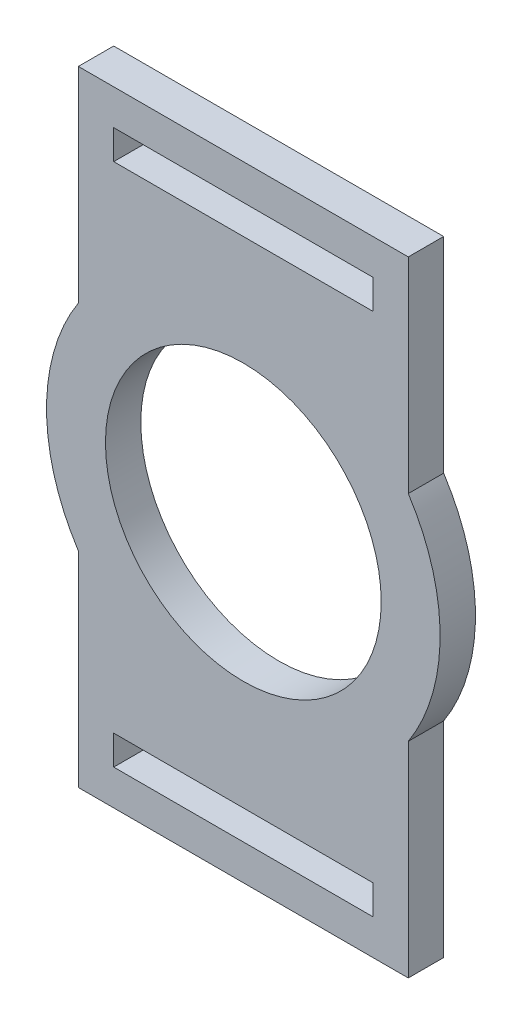
ISO-10303-21;
HEADER;
FILE_DESCRIPTION(('STEP AP214'),'2;1');
FILE_NAME('part.step','',(''),(''),'','','');
FILE_SCHEMA(('AUTOMOTIVE_DESIGN { 1 0 10303 214 1 1 1 1 }'));
ENDSEC;
DATA;
#1=APPLICATION_CONTEXT('core data for automotive mechanical design processes');
#2=APPLICATION_PROTOCOL_DEFINITION('international standard','automotive_design',2000,#1);
#3=PRODUCT_CONTEXT('',#1,'mechanical');
#4=PRODUCT('Part','Part','',(#3));
#5=PRODUCT_RELATED_PRODUCT_CATEGORY('part','',(#4));
#6=PRODUCT_DEFINITION_FORMATION('','',#4);
#7=PRODUCT_DEFINITION_CONTEXT('part definition',#1,'design');
#8=PRODUCT_DEFINITION('design','',#6,#7);
#9=PRODUCT_DEFINITION_SHAPE('','',#8);
#10=(LENGTH_UNIT() NAMED_UNIT(*) SI_UNIT(.MILLI.,.METRE.));
#11=(NAMED_UNIT(*) PLANE_ANGLE_UNIT() SI_UNIT($,.RADIAN.));
#12=(NAMED_UNIT(*) SI_UNIT($,.STERADIAN.) SOLID_ANGLE_UNIT());
#13=UNCERTAINTY_MEASURE_WITH_UNIT(LENGTH_MEASURE(1.E-05),#10,'distance_accuracy_value','');
#14=(GEOMETRIC_REPRESENTATION_CONTEXT(3) GLOBAL_UNCERTAINTY_ASSIGNED_CONTEXT((#13)) GLOBAL_UNIT_ASSIGNED_CONTEXT((#10,
#11,#12)) REPRESENTATION_CONTEXT('',''));
#15=CARTESIAN_POINT('',(0.,0.,0.));
#16=DIRECTION('',(0.,0.,1.));
#17=DIRECTION('',(1.,0.,0.));
#18=AXIS2_PLACEMENT_3D('',#15,#16,#17);
#19=CARTESIAN_POINT('',(0.,0.,3.));
#20=DIRECTION('',(0.,0.,-1.));
#21=DIRECTION('',(-1.,0.,0.));
#22=AXIS2_PLACEMENT_3D('',#19,#20,#21);
#23=PLANE('',#22);
#24=DIRECTION('',(0.,-1.,0.));
#25=VECTOR('',#24,1.);
#26=CARTESIAN_POINT('',(-11.,21.,3.));
#27=LINE('',#26,#25);
#28=CARTESIAN_POINT('',(-11.,23.5,3.));
#29=VERTEX_POINT('',#28);
#30=CARTESIAN_POINT('',(-11.,21.,3.));
#31=VERTEX_POINT('',#30);
#32=EDGE_CURVE('E185',#29,#31,#27,.T.);
#33=ORIENTED_EDGE('',*,*,#32,.F.);
#34=DIRECTION('',(-1.,0.,0.));
#35=VECTOR('',#34,1.);
#36=CARTESIAN_POINT('',(-11.,23.5,3.));
#37=LINE('',#36,#35);
#38=CARTESIAN_POINT('',(11.,23.5,3.));
#39=VERTEX_POINT('',#38);
#40=EDGE_CURVE('E193',#39,#29,#37,.T.);
#41=ORIENTED_EDGE('',*,*,#40,.F.);
#42=DIRECTION('',(0.,1.,0.));
#43=VECTOR('',#42,1.);
#44=CARTESIAN_POINT('',(11.,21.,3.));
#45=LINE('',#44,#43);
#46=CARTESIAN_POINT('',(11.,21.,3.));
#47=VERTEX_POINT('',#46);
#48=EDGE_CURVE('E190',#47,#39,#45,.T.);
#49=ORIENTED_EDGE('',*,*,#48,.F.);
#50=DIRECTION('',(1.,0.,0.));
#51=VECTOR('',#50,1.);
#52=CARTESIAN_POINT('',(11.,21.,3.));
#53=LINE('',#52,#51);
#54=EDGE_CURVE('E187',#31,#47,#53,.T.);
#55=ORIENTED_EDGE('',*,*,#54,.F.);
#56=EDGE_LOOP('',(#33,#41,#49,#55));
#57=FACE_BOUND('',#56,.T.);
#58=CARTESIAN_POINT('',(0.,0.,3.));
#59=DIRECTION('',(0.,0.,1.));
#60=DIRECTION('',(-1.,0.,0.));
#61=AXIS2_PLACEMENT_3D('',#58,#59,#60);
#62=CIRCLE('',#61,16.7);
#63=CARTESIAN_POINT('',(-14.,9.10439454329611,3.));
#64=VERTEX_POINT('',#63);
#65=CARTESIAN_POINT('',(-14.,-9.10439454329611,3.));
#66=VERTEX_POINT('',#65);
#67=EDGE_CURVE('E222',#64,#66,#62,.T.);
#68=ORIENTED_EDGE('',*,*,#67,.T.);
#69=DIRECTION('',(0.,-1.,0.));
#70=VECTOR('',#69,1.);
#71=CARTESIAN_POINT('',(-14.,-9.10439454329611,3.));
#72=LINE('',#71,#70);
#73=CARTESIAN_POINT('',(-14.,-26.5,3.));
#74=VERTEX_POINT('',#73);
#75=EDGE_CURVE('E225',#66,#74,#72,.T.);
#76=ORIENTED_EDGE('',*,*,#75,.T.);
#77=DIRECTION('',(1.,0.,0.));
#78=VECTOR('',#77,1.);
#79=CARTESIAN_POINT('',(-14.,-26.5,3.));
#80=LINE('',#79,#78);
#81=CARTESIAN_POINT('',(14.,-26.5,3.));
#82=VERTEX_POINT('',#81);
#83=EDGE_CURVE('E228',#74,#82,#80,.T.);
#84=ORIENTED_EDGE('',*,*,#83,.T.);
#85=DIRECTION('',(0.,1.,0.));
#86=VECTOR('',#85,1.);
#87=CARTESIAN_POINT('',(14.,-9.10439454329611,3.));
#88=LINE('',#87,#86);
#89=CARTESIAN_POINT('',(14.,-9.10439454329611,3.));
#90=VERTEX_POINT('',#89);
#91=EDGE_CURVE('E230',#82,#90,#88,.T.);
#92=ORIENTED_EDGE('',*,*,#91,.T.);
#93=CARTESIAN_POINT('',(-2.18575157973078E-13,0.,3.));
#94=DIRECTION('',(0.,0.,1.));
#95=DIRECTION('',(-1.,0.,0.));
#96=AXIS2_PLACEMENT_3D('',#93,#94,#95);
#97=CIRCLE('',#96,16.7000000000002);
#98=CARTESIAN_POINT('',(14.,9.10439454329611,3.));
#99=VERTEX_POINT('',#98);
#100=EDGE_CURVE('E232',#90,#99,#97,.T.);
#101=ORIENTED_EDGE('',*,*,#100,.T.);
#102=DIRECTION('',(0.,1.,0.));
#103=VECTOR('',#102,1.);
#104=CARTESIAN_POINT('',(14.,9.10439454329611,3.));
#105=LINE('',#104,#103);
#106=CARTESIAN_POINT('',(14.,26.5,3.));
#107=VERTEX_POINT('',#106);
#108=EDGE_CURVE('E234',#99,#107,#105,.T.);
#109=ORIENTED_EDGE('',*,*,#108,.T.);
#110=DIRECTION('',(-1.,0.,0.));
#111=VECTOR('',#110,1.);
#112=CARTESIAN_POINT('',(-14.,26.5,3.));
#113=LINE('',#112,#111);
#114=CARTESIAN_POINT('',(-14.,26.5,3.));
#115=VERTEX_POINT('',#114);
#116=EDGE_CURVE('E236',#107,#115,#113,.T.);
#117=ORIENTED_EDGE('',*,*,#116,.T.);
#118=DIRECTION('',(0.,-1.,0.));
#119=VECTOR('',#118,1.);
#120=CARTESIAN_POINT('',(-14.,9.10439454329611,3.));
#121=LINE('',#120,#119);
#122=EDGE_CURVE('E238',#115,#64,#121,.T.);
#123=ORIENTED_EDGE('',*,*,#122,.T.);
#124=EDGE_LOOP('',(#68,#76,#84,#92,#101,#109,#117,#123));
#125=FACE_BOUND('',#124,.T.);
#126=CARTESIAN_POINT('',(0.,0.,3.));
#127=DIRECTION('',(0.,0.,1.));
#128=DIRECTION('',(1.,0.,0.));
#129=AXIS2_PLACEMENT_3D('',#126,#127,#128);
#130=CIRCLE('',#129,11.7);
#131=CARTESIAN_POINT('',(11.7,0.,3.));
#132=VERTEX_POINT('',#131);
#133=EDGE_CURVE('E216',#132,#132,#130,.T.);
#134=ORIENTED_EDGE('',*,*,#133,.F.);
#135=EDGE_LOOP('',(#134));
#136=FACE_BOUND('',#135,.T.);
#137=DIRECTION('',(-1.,0.,0.));
#138=VECTOR('',#137,1.);
#139=CARTESIAN_POINT('',(11.,-21.,3.));
#140=LINE('',#139,#138);
#141=CARTESIAN_POINT('',(11.,-21.,3.));
#142=VERTEX_POINT('',#141);
#143=CARTESIAN_POINT('',(-11.,-21.,3.));
#144=VERTEX_POINT('',#143);
#145=EDGE_CURVE('E149',#142,#144,#140,.T.);
#146=ORIENTED_EDGE('',*,*,#145,.F.);
#147=DIRECTION('',(0.,1.,0.));
#148=VECTOR('',#147,1.);
#149=CARTESIAN_POINT('',(11.,-21.,3.));
#150=LINE('',#149,#148);
#151=CARTESIAN_POINT('',(11.,-23.5,3.));
#152=VERTEX_POINT('',#151);
#153=EDGE_CURVE('E171',#152,#142,#150,.T.);
#154=ORIENTED_EDGE('',*,*,#153,.F.);
#155=DIRECTION('',(1.,0.,0.));
#156=VECTOR('',#155,1.);
#157=CARTESIAN_POINT('',(-11.,-23.5,3.));
#158=LINE('',#157,#156);
#159=CARTESIAN_POINT('',(-11.,-23.5,3.));
#160=VERTEX_POINT('',#159);
#161=EDGE_CURVE('E169',#160,#152,#158,.T.);
#162=ORIENTED_EDGE('',*,*,#161,.F.);
#163=DIRECTION('',(0.,-1.,0.));
#164=VECTOR('',#163,1.);
#165=CARTESIAN_POINT('',(-11.,-21.,3.));
#166=LINE('',#165,#164);
#167=EDGE_CURVE('E157',#144,#160,#166,.T.);
#168=ORIENTED_EDGE('',*,*,#167,.F.);
#169=EDGE_LOOP('',(#146,#154,#162,#168));
#170=FACE_BOUND('',#169,.T.);
#171=ADVANCED_FACE('F36',(#57,#125,#136,#170),#23,.F.);
#172=CARTESIAN_POINT('',(0.,0.,0.));
#173=DIRECTION('',(0.,0.,-1.));
#174=DIRECTION('',(-1.,0.,0.));
#175=AXIS2_PLACEMENT_3D('',#172,#173,#174);
#176=PLANE('',#175);
#177=CARTESIAN_POINT('',(0.,0.,0.));
#178=DIRECTION('',(0.,0.,1.));
#179=DIRECTION('',(-1.,0.,0.));
#180=AXIS2_PLACEMENT_3D('',#177,#178,#179);
#181=CIRCLE('',#180,16.7);
#182=CARTESIAN_POINT('',(-14.,9.10439454329611,0.));
#183=VERTEX_POINT('',#182);
#184=CARTESIAN_POINT('',(-14.,-9.10439454329611,0.));
#185=VERTEX_POINT('',#184);
#186=EDGE_CURVE('E219',#183,#185,#181,.T.);
#187=ORIENTED_EDGE('',*,*,#186,.F.);
#188=DIRECTION('',(0.,-1.,0.));
#189=VECTOR('',#188,1.);
#190=CARTESIAN_POINT('',(-14.,9.10439454329611,0.));
#191=LINE('',#190,#189);
#192=CARTESIAN_POINT('',(-14.,26.5,0.));
#193=VERTEX_POINT('',#192);
#194=EDGE_CURVE('E226',#193,#183,#191,.T.);
#195=ORIENTED_EDGE('',*,*,#194,.F.);
#196=DIRECTION('',(-1.,0.,0.));
#197=VECTOR('',#196,1.);
#198=CARTESIAN_POINT('',(-14.,26.5,0.));
#199=LINE('',#198,#197);
#200=CARTESIAN_POINT('',(14.,26.5,0.));
#201=VERTEX_POINT('',#200);
#202=EDGE_CURVE('E253',#201,#193,#199,.T.);
#203=ORIENTED_EDGE('',*,*,#202,.F.);
#204=DIRECTION('',(0.,1.,0.));
#205=VECTOR('',#204,1.);
#206=CARTESIAN_POINT('',(14.,9.10439454329611,0.));
#207=LINE('',#206,#205);
#208=CARTESIAN_POINT('',(14.,9.10439454329611,0.));
#209=VERTEX_POINT('',#208);
#210=EDGE_CURVE('E251',#209,#201,#207,.T.);
#211=ORIENTED_EDGE('',*,*,#210,.F.);
#212=CARTESIAN_POINT('',(-2.18575157973078E-13,0.,0.));
#213=DIRECTION('',(0.,0.,1.));
#214=DIRECTION('',(-1.,0.,0.));
#215=AXIS2_PLACEMENT_3D('',#212,#213,#214);
#216=CIRCLE('',#215,16.7000000000002);
#217=CARTESIAN_POINT('',(14.,-9.10439454329611,0.));
#218=VERTEX_POINT('',#217);
#219=EDGE_CURVE('E249',#218,#209,#216,.T.);
#220=ORIENTED_EDGE('',*,*,#219,.F.);
#221=DIRECTION('',(0.,1.,0.));
#222=VECTOR('',#221,1.);
#223=CARTESIAN_POINT('',(14.,-9.10439454329611,0.));
#224=LINE('',#223,#222);
#225=CARTESIAN_POINT('',(14.,-26.5,0.));
#226=VERTEX_POINT('',#225);
#227=EDGE_CURVE('E247',#226,#218,#224,.T.);
#228=ORIENTED_EDGE('',*,*,#227,.F.);
#229=DIRECTION('',(1.,0.,0.));
#230=VECTOR('',#229,1.);
#231=CARTESIAN_POINT('',(-14.,-26.5,0.));
#232=LINE('',#231,#230);
#233=CARTESIAN_POINT('',(-14.,-26.5,0.));
#234=VERTEX_POINT('',#233);
#235=EDGE_CURVE('E245',#234,#226,#232,.T.);
#236=ORIENTED_EDGE('',*,*,#235,.F.);
#237=DIRECTION('',(0.,-1.,0.));
#238=VECTOR('',#237,1.);
#239=CARTESIAN_POINT('',(-14.,-9.10439454329611,0.));
#240=LINE('',#239,#238);
#241=EDGE_CURVE('E243',#185,#234,#240,.T.);
#242=ORIENTED_EDGE('',*,*,#241,.F.);
#243=EDGE_LOOP('',(#187,#195,#203,#211,#220,#228,#236,#242));
#244=FACE_BOUND('',#243,.T.);
#245=CARTESIAN_POINT('',(0.,0.,0.));
#246=DIRECTION('',(0.,0.,1.));
#247=DIRECTION('',(1.,0.,0.));
#248=AXIS2_PLACEMENT_3D('',#245,#246,#247);
#249=CIRCLE('',#248,11.7);
#250=CARTESIAN_POINT('',(11.7,0.,0.));
#251=VERTEX_POINT('',#250);
#252=EDGE_CURVE('E215',#251,#251,#249,.T.);
#253=ORIENTED_EDGE('',*,*,#252,.T.);
#254=EDGE_LOOP('',(#253));
#255=FACE_BOUND('',#254,.T.);
#256=DIRECTION('',(-1.,0.,0.));
#257=VECTOR('',#256,1.);
#258=CARTESIAN_POINT('',(-11.,23.5,0.));
#259=LINE('',#258,#257);
#260=CARTESIAN_POINT('',(11.,23.5,0.));
#261=VERTEX_POINT('',#260);
#262=CARTESIAN_POINT('',(-11.,23.5,0.));
#263=VERTEX_POINT('',#262);
#264=EDGE_CURVE('E188',#261,#263,#259,.T.);
#265=ORIENTED_EDGE('',*,*,#264,.T.);
#266=DIRECTION('',(0.,-1.,0.));
#267=VECTOR('',#266,1.);
#268=CARTESIAN_POINT('',(-11.,21.,0.));
#269=LINE('',#268,#267);
#270=CARTESIAN_POINT('',(-11.,21.,0.));
#271=VERTEX_POINT('',#270);
#272=EDGE_CURVE('E165',#263,#271,#269,.T.);
#273=ORIENTED_EDGE('',*,*,#272,.T.);
#274=DIRECTION('',(1.,0.,0.));
#275=VECTOR('',#274,1.);
#276=CARTESIAN_POINT('',(11.,21.,0.));
#277=LINE('',#276,#275);
#278=CARTESIAN_POINT('',(11.,21.,0.));
#279=VERTEX_POINT('',#278);
#280=EDGE_CURVE('E198',#271,#279,#277,.T.);
#281=ORIENTED_EDGE('',*,*,#280,.T.);
#282=DIRECTION('',(0.,1.,0.));
#283=VECTOR('',#282,1.);
#284=CARTESIAN_POINT('',(11.,21.,0.));
#285=LINE('',#284,#283);
#286=EDGE_CURVE('E201',#279,#261,#285,.T.);
#287=ORIENTED_EDGE('',*,*,#286,.T.);
#288=EDGE_LOOP('',(#265,#273,#281,#287));
#289=FACE_BOUND('',#288,.T.);
#290=DIRECTION('',(0.,1.,0.));
#291=VECTOR('',#290,1.);
#292=CARTESIAN_POINT('',(11.,-21.,0.));
#293=LINE('',#292,#291);
#294=CARTESIAN_POINT('',(11.,-23.5,0.));
#295=VERTEX_POINT('',#294);
#296=CARTESIAN_POINT('',(11.,-21.,0.));
#297=VERTEX_POINT('',#296);
#298=EDGE_CURVE('E158',#295,#297,#293,.T.);
#299=ORIENTED_EDGE('',*,*,#298,.T.);
#300=DIRECTION('',(-1.,0.,0.));
#301=VECTOR('',#300,1.);
#302=CARTESIAN_POINT('',(11.,-21.,0.));
#303=LINE('',#302,#301);
#304=CARTESIAN_POINT('',(-11.,-21.,0.));
#305=VERTEX_POINT('',#304);
#306=EDGE_CURVE('E59',#297,#305,#303,.T.);
#307=ORIENTED_EDGE('',*,*,#306,.T.);
#308=DIRECTION('',(0.,-1.,0.));
#309=VECTOR('',#308,1.);
#310=CARTESIAN_POINT('',(-11.,-21.,0.));
#311=LINE('',#310,#309);
#312=CARTESIAN_POINT('',(-11.,-23.5,0.));
#313=VERTEX_POINT('',#312);
#314=EDGE_CURVE('E164',#305,#313,#311,.T.);
#315=ORIENTED_EDGE('',*,*,#314,.T.);
#316=DIRECTION('',(1.,0.,0.));
#317=VECTOR('',#316,1.);
#318=CARTESIAN_POINT('',(-11.,-23.5,0.));
#319=LINE('',#318,#317);
#320=EDGE_CURVE('E177',#313,#295,#319,.T.);
#321=ORIENTED_EDGE('',*,*,#320,.T.);
#322=EDGE_LOOP('',(#299,#307,#315,#321));
#323=FACE_BOUND('',#322,.T.);
#324=ADVANCED_FACE('F283',(#244,#255,#289,#323),#176,.T.);
#325=CARTESIAN_POINT('',(0.,0.,3.));
#326=DIRECTION('',(0.,0.,-1.));
#327=DIRECTION('',(-1.,0.,0.));
#328=AXIS2_PLACEMENT_3D('',#325,#326,#327);
#329=CYLINDRICAL_SURFACE('',#328,16.7);
#330=ORIENTED_EDGE('',*,*,#186,.T.);
#331=DIRECTION('',(0.,0.,-1.));
#332=VECTOR('',#331,1.);
#333=CARTESIAN_POINT('',(-14.,-9.10439454329611,3.));
#334=LINE('',#333,#332);
#335=EDGE_CURVE('E11',#66,#185,#334,.T.);
#336=ORIENTED_EDGE('',*,*,#335,.F.);
#337=ORIENTED_EDGE('',*,*,#67,.F.);
#338=DIRECTION('',(0.,0.,-1.));
#339=VECTOR('',#338,1.);
#340=CARTESIAN_POINT('',(-14.,9.10439454329611,3.));
#341=LINE('',#340,#339);
#342=EDGE_CURVE('E240',#64,#183,#341,.T.);
#343=ORIENTED_EDGE('',*,*,#342,.T.);
#344=EDGE_LOOP('',(#330,#336,#337,#343));
#345=FACE_BOUND('',#344,.T.);
#346=ADVANCED_FACE('F38',(#345),#329,.T.);
#347=CARTESIAN_POINT('',(-14.,-9.10439454329611,3.));
#348=DIRECTION('',(1.,0.,0.));
#349=DIRECTION('',(0.,0.,-1.));
#350=AXIS2_PLACEMENT_3D('',#347,#348,#349);
#351=PLANE('',#350);
#352=ORIENTED_EDGE('',*,*,#241,.T.);
#353=DIRECTION('',(0.,0.,-1.));
#354=VECTOR('',#353,1.);
#355=CARTESIAN_POINT('',(-14.,-26.5,3.));
#356=LINE('',#355,#354);
#357=EDGE_CURVE('E44',#74,#234,#356,.T.);
#358=ORIENTED_EDGE('',*,*,#357,.F.);
#359=ORIENTED_EDGE('',*,*,#75,.F.);
#360=ORIENTED_EDGE('',*,*,#335,.T.);
#361=EDGE_LOOP('',(#352,#358,#359,#360));
#362=FACE_BOUND('',#361,.T.);
#363=ADVANCED_FACE('F301',(#362),#351,.F.);
#364=CARTESIAN_POINT('',(-14.,-26.5,3.));
#365=DIRECTION('',(0.,1.,0.));
#366=DIRECTION('',(0.,0.,1.));
#367=AXIS2_PLACEMENT_3D('',#364,#365,#366);
#368=PLANE('',#367);
#369=ORIENTED_EDGE('',*,*,#235,.T.);
#370=DIRECTION('',(0.,0.,-1.));
#371=VECTOR('',#370,1.);
#372=CARTESIAN_POINT('',(14.,-26.5,3.));
#373=LINE('',#372,#371);
#374=EDGE_CURVE('E270',#82,#226,#373,.T.);
#375=ORIENTED_EDGE('',*,*,#374,.F.);
#376=ORIENTED_EDGE('',*,*,#83,.F.);
#377=ORIENTED_EDGE('',*,*,#357,.T.);
#378=EDGE_LOOP('',(#369,#375,#376,#377));
#379=FACE_BOUND('',#378,.T.);
#380=ADVANCED_FACE('F277',(#379),#368,.F.);
#381=CARTESIAN_POINT('',(14.,-9.10439454329611,3.));
#382=DIRECTION('',(-1.,0.,0.));
#383=DIRECTION('',(0.,0.,1.));
#384=AXIS2_PLACEMENT_3D('',#381,#382,#383);
#385=PLANE('',#384);
#386=ORIENTED_EDGE('',*,*,#227,.T.);
#387=DIRECTION('',(0.,0.,-1.));
#388=VECTOR('',#387,1.);
#389=CARTESIAN_POINT('',(14.,-9.10439454329611,3.));
#390=LINE('',#389,#388);
#391=EDGE_CURVE('E267',#90,#218,#390,.T.);
#392=ORIENTED_EDGE('',*,*,#391,.F.);
#393=ORIENTED_EDGE('',*,*,#91,.F.);
#394=ORIENTED_EDGE('',*,*,#374,.T.);
#395=EDGE_LOOP('',(#386,#392,#393,#394));
#396=FACE_BOUND('',#395,.T.);
#397=ADVANCED_FACE('F289',(#396),#385,.F.);
#398=CARTESIAN_POINT('',(-2.18575157973078E-13,0.,3.));
#399=DIRECTION('',(0.,0.,-1.));
#400=DIRECTION('',(-1.,0.,0.));
#401=AXIS2_PLACEMENT_3D('',#398,#399,#400);
#402=CYLINDRICAL_SURFACE('',#401,16.7000000000002);
#403=ORIENTED_EDGE('',*,*,#219,.T.);
#404=DIRECTION('',(0.,0.,-1.));
#405=VECTOR('',#404,1.);
#406=CARTESIAN_POINT('',(14.,9.10439454329611,3.));
#407=LINE('',#406,#405);
#408=EDGE_CURVE('E264',#99,#209,#407,.T.);
#409=ORIENTED_EDGE('',*,*,#408,.F.);
#410=ORIENTED_EDGE('',*,*,#100,.F.);
#411=ORIENTED_EDGE('',*,*,#391,.T.);
#412=EDGE_LOOP('',(#403,#409,#410,#411));
#413=FACE_BOUND('',#412,.T.);
#414=ADVANCED_FACE('F293',(#413),#402,.T.);
#415=CARTESIAN_POINT('',(14.,9.10439454329611,3.));
#416=DIRECTION('',(-1.,0.,0.));
#417=DIRECTION('',(0.,0.,1.));
#418=AXIS2_PLACEMENT_3D('',#415,#416,#417);
#419=PLANE('',#418);
#420=ORIENTED_EDGE('',*,*,#210,.T.);
#421=DIRECTION('',(0.,0.,-1.));
#422=VECTOR('',#421,1.);
#423=CARTESIAN_POINT('',(14.,26.5,3.));
#424=LINE('',#423,#422);
#425=EDGE_CURVE('E261',#107,#201,#424,.T.);
#426=ORIENTED_EDGE('',*,*,#425,.F.);
#427=ORIENTED_EDGE('',*,*,#108,.F.);
#428=ORIENTED_EDGE('',*,*,#408,.T.);
#429=EDGE_LOOP('',(#420,#426,#427,#428));
#430=FACE_BOUND('',#429,.T.);
#431=ADVANCED_FACE('F314',(#430),#419,.F.);
#432=CARTESIAN_POINT('',(-14.,26.5,3.));
#433=DIRECTION('',(0.,-1.,0.));
#434=DIRECTION('',(0.,0.,-1.));
#435=AXIS2_PLACEMENT_3D('',#432,#433,#434);
#436=PLANE('',#435);
#437=ORIENTED_EDGE('',*,*,#202,.T.);
#438=DIRECTION('',(0.,0.,-1.));
#439=VECTOR('',#438,1.);
#440=CARTESIAN_POINT('',(-14.,26.5,3.));
#441=LINE('',#440,#439);
#442=EDGE_CURVE('E258',#115,#193,#441,.T.);
#443=ORIENTED_EDGE('',*,*,#442,.F.);
#444=ORIENTED_EDGE('',*,*,#116,.F.);
#445=ORIENTED_EDGE('',*,*,#425,.T.);
#446=EDGE_LOOP('',(#437,#443,#444,#445));
#447=FACE_BOUND('',#446,.T.);
#448=ADVANCED_FACE('F312',(#447),#436,.F.);
#449=CARTESIAN_POINT('',(-14.,9.10439454329611,3.));
#450=DIRECTION('',(1.,0.,0.));
#451=DIRECTION('',(0.,0.,-1.));
#452=AXIS2_PLACEMENT_3D('',#449,#450,#451);
#453=PLANE('',#452);
#454=ORIENTED_EDGE('',*,*,#194,.T.);
#455=ORIENTED_EDGE('',*,*,#342,.F.);
#456=ORIENTED_EDGE('',*,*,#122,.F.);
#457=ORIENTED_EDGE('',*,*,#442,.T.);
#458=EDGE_LOOP('',(#454,#455,#456,#457));
#459=FACE_BOUND('',#458,.T.);
#460=ADVANCED_FACE('F307',(#459),#453,.F.);
#461=CARTESIAN_POINT('',(0.,0.,3.));
#462=DIRECTION('',(0.,0.,-1.));
#463=DIRECTION('',(-1.,0.,0.));
#464=AXIS2_PLACEMENT_3D('',#461,#462,#463);
#465=CYLINDRICAL_SURFACE('',#464,11.7);
#466=ORIENTED_EDGE('',*,*,#133,.T.);
#467=EDGE_LOOP('',(#466));
#468=FACE_BOUND('',#467,.T.);
#469=ORIENTED_EDGE('',*,*,#252,.F.);
#470=EDGE_LOOP('',(#469));
#471=FACE_BOUND('',#470,.T.);
#472=ADVANCED_FACE('F332',(#468,#471),#465,.F.);
#473=CARTESIAN_POINT('',(-11.,21.,3.));
#474=DIRECTION('',(1.,0.,0.));
#475=DIRECTION('',(0.,0.,-1.));
#476=AXIS2_PLACEMENT_3D('',#473,#474,#475);
#477=PLANE('',#476);
#478=ORIENTED_EDGE('',*,*,#272,.F.);
#479=DIRECTION('',(0.,0.,-1.));
#480=VECTOR('',#479,1.);
#481=CARTESIAN_POINT('',(-11.,23.5,3.));
#482=LINE('',#481,#480);
#483=EDGE_CURVE('E195',#29,#263,#482,.T.);
#484=ORIENTED_EDGE('',*,*,#483,.F.);
#485=ORIENTED_EDGE('',*,*,#32,.T.);
#486=DIRECTION('',(0.,0.,-1.));
#487=VECTOR('',#486,1.);
#488=CARTESIAN_POINT('',(-11.,21.,3.));
#489=LINE('',#488,#487);
#490=EDGE_CURVE('E212',#31,#271,#489,.T.);
#491=ORIENTED_EDGE('',*,*,#490,.T.);
#492=EDGE_LOOP('',(#478,#484,#485,#491));
#493=FACE_BOUND('',#492,.T.);
#494=ADVANCED_FACE('F339',(#493),#477,.T.);
#495=CARTESIAN_POINT('',(11.,21.,3.));
#496=DIRECTION('',(0.,1.,0.));
#497=DIRECTION('',(0.,0.,1.));
#498=AXIS2_PLACEMENT_3D('',#495,#496,#497);
#499=PLANE('',#498);
#500=ORIENTED_EDGE('',*,*,#280,.F.);
#501=ORIENTED_EDGE('',*,*,#490,.F.);
#502=ORIENTED_EDGE('',*,*,#54,.T.);
#503=DIRECTION('',(0.,0.,-1.));
#504=VECTOR('',#503,1.);
#505=CARTESIAN_POINT('',(11.,21.,3.));
#506=LINE('',#505,#504);
#507=EDGE_CURVE('E210',#47,#279,#506,.T.);
#508=ORIENTED_EDGE('',*,*,#507,.T.);
#509=EDGE_LOOP('',(#500,#501,#502,#508));
#510=FACE_BOUND('',#509,.T.);
#511=ADVANCED_FACE('F344',(#510),#499,.T.);
#512=CARTESIAN_POINT('',(11.,21.,3.));
#513=DIRECTION('',(-1.,0.,0.));
#514=DIRECTION('',(0.,0.,1.));
#515=AXIS2_PLACEMENT_3D('',#512,#513,#514);
#516=PLANE('',#515);
#517=ORIENTED_EDGE('',*,*,#286,.F.);
#518=ORIENTED_EDGE('',*,*,#507,.F.);
#519=ORIENTED_EDGE('',*,*,#48,.T.);
#520=DIRECTION('',(0.,0.,-1.));
#521=VECTOR('',#520,1.);
#522=CARTESIAN_POINT('',(11.,23.5,3.));
#523=LINE('',#522,#521);
#524=EDGE_CURVE('E208',#39,#261,#523,.T.);
#525=ORIENTED_EDGE('',*,*,#524,.T.);
#526=EDGE_LOOP('',(#517,#518,#519,#525));
#527=FACE_BOUND('',#526,.T.);
#528=ADVANCED_FACE('F370',(#527),#516,.T.);
#529=CARTESIAN_POINT('',(-11.,23.5,3.));
#530=DIRECTION('',(0.,-1.,0.));
#531=DIRECTION('',(0.,0.,-1.));
#532=AXIS2_PLACEMENT_3D('',#529,#530,#531);
#533=PLANE('',#532);
#534=ORIENTED_EDGE('',*,*,#264,.F.);
#535=ORIENTED_EDGE('',*,*,#524,.F.);
#536=ORIENTED_EDGE('',*,*,#40,.T.);
#537=ORIENTED_EDGE('',*,*,#483,.T.);
#538=EDGE_LOOP('',(#534,#535,#536,#537));
#539=FACE_BOUND('',#538,.T.);
#540=ADVANCED_FACE('F367',(#539),#533,.T.);
#541=CARTESIAN_POINT('',(11.,-21.,3.));
#542=DIRECTION('',(0.,-1.,0.));
#543=DIRECTION('',(0.,0.,-1.));
#544=AXIS2_PLACEMENT_3D('',#541,#542,#543);
#545=PLANE('',#544);
#546=ORIENTED_EDGE('',*,*,#306,.F.);
#547=DIRECTION('',(0.,0.,-1.));
#548=VECTOR('',#547,1.);
#549=CARTESIAN_POINT('',(11.,-21.,3.));
#550=LINE('',#549,#548);
#551=EDGE_CURVE('E153',#142,#297,#550,.T.);
#552=ORIENTED_EDGE('',*,*,#551,.F.);
#553=ORIENTED_EDGE('',*,*,#145,.T.);
#554=DIRECTION('',(0.,0.,-1.));
#555=VECTOR('',#554,1.);
#556=CARTESIAN_POINT('',(-11.,-21.,3.));
#557=LINE('',#556,#555);
#558=EDGE_CURVE('E152',#144,#305,#557,.T.);
#559=ORIENTED_EDGE('',*,*,#558,.T.);
#560=EDGE_LOOP('',(#546,#552,#553,#559));
#561=FACE_BOUND('',#560,.T.);
#562=ADVANCED_FACE('F151',(#561),#545,.T.);
#563=CARTESIAN_POINT('',(-11.,-21.,3.));
#564=DIRECTION('',(1.,0.,0.));
#565=DIRECTION('',(0.,0.,-1.));
#566=AXIS2_PLACEMENT_3D('',#563,#564,#565);
#567=PLANE('',#566);
#568=ORIENTED_EDGE('',*,*,#314,.F.);
#569=ORIENTED_EDGE('',*,*,#558,.F.);
#570=ORIENTED_EDGE('',*,*,#167,.T.);
#571=DIRECTION('',(0.,0.,-1.));
#572=VECTOR('',#571,1.);
#573=CARTESIAN_POINT('',(-11.,-23.5,3.));
#574=LINE('',#573,#572);
#575=EDGE_CURVE('E166',#160,#313,#574,.T.);
#576=ORIENTED_EDGE('',*,*,#575,.T.);
#577=EDGE_LOOP('',(#568,#569,#570,#576));
#578=FACE_BOUND('',#577,.T.);
#579=ADVANCED_FACE('F161',(#578),#567,.T.);
#580=CARTESIAN_POINT('',(-11.,-23.5,3.));
#581=DIRECTION('',(0.,1.,0.));
#582=DIRECTION('',(0.,0.,1.));
#583=AXIS2_PLACEMENT_3D('',#580,#581,#582);
#584=PLANE('',#583);
#585=ORIENTED_EDGE('',*,*,#320,.F.);
#586=ORIENTED_EDGE('',*,*,#575,.F.);
#587=ORIENTED_EDGE('',*,*,#161,.T.);
#588=DIRECTION('',(0.,0.,-1.));
#589=VECTOR('',#588,1.);
#590=CARTESIAN_POINT('',(11.,-23.5,3.));
#591=LINE('',#590,#589);
#592=EDGE_CURVE('E51',#152,#295,#591,.T.);
#593=ORIENTED_EDGE('',*,*,#592,.T.);
#594=EDGE_LOOP('',(#585,#586,#587,#593));
#595=FACE_BOUND('',#594,.T.);
#596=ADVANCED_FACE('F355',(#595),#584,.T.);
#597=CARTESIAN_POINT('',(11.,-21.,3.));
#598=DIRECTION('',(-1.,0.,0.));
#599=DIRECTION('',(0.,0.,1.));
#600=AXIS2_PLACEMENT_3D('',#597,#598,#599);
#601=PLANE('',#600);
#602=ORIENTED_EDGE('',*,*,#298,.F.);
#603=ORIENTED_EDGE('',*,*,#592,.F.);
#604=ORIENTED_EDGE('',*,*,#153,.T.);
#605=ORIENTED_EDGE('',*,*,#551,.T.);
#606=EDGE_LOOP('',(#602,#603,#604,#605));
#607=FACE_BOUND('',#606,.T.);
#608=ADVANCED_FACE('F353',(#607),#601,.T.);
#609=CLOSED_SHELL('',(#171,#324,#346,#363,#380,#397,#414,#431,#448,#460,#472,#494,#511,#528,
#540,#562,#579,#596,#608));
#610=MANIFOLD_SOLID_BREP('B2',#609);
#611=ADVANCED_BREP_SHAPE_REPRESENTATION('',(#18,#610),#14);
#612=SHAPE_DEFINITION_REPRESENTATION(#9,#611);
ENDSEC;
END-ISO-10303-21;
